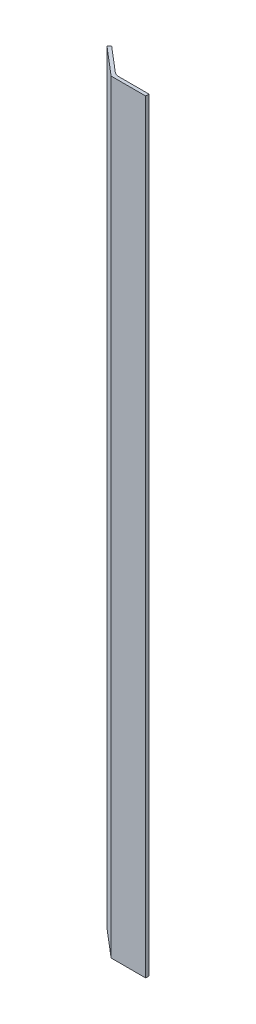
ISO-10303-21;
HEADER;
FILE_DESCRIPTION(('STEP AP214'),'2;1');
FILE_NAME('part.step','',(''),(''),'','','');
FILE_SCHEMA(('AUTOMOTIVE_DESIGN { 1 0 10303 214 1 1 1 1 }'));
ENDSEC;
DATA;
#1=APPLICATION_CONTEXT('core data for automotive mechanical design processes');
#2=APPLICATION_PROTOCOL_DEFINITION('international standard','automotive_design',2000,#1);
#3=PRODUCT_CONTEXT('',#1,'mechanical');
#4=PRODUCT('Part','Part','',(#3));
#5=PRODUCT_RELATED_PRODUCT_CATEGORY('part','',(#4));
#6=PRODUCT_DEFINITION_FORMATION('','',#4);
#7=PRODUCT_DEFINITION_CONTEXT('part definition',#1,'design');
#8=PRODUCT_DEFINITION('design','',#6,#7);
#9=PRODUCT_DEFINITION_SHAPE('','',#8);
#10=(LENGTH_UNIT() NAMED_UNIT(*) SI_UNIT(.MILLI.,.METRE.));
#11=(NAMED_UNIT(*) PLANE_ANGLE_UNIT() SI_UNIT($,.RADIAN.));
#12=(NAMED_UNIT(*) SI_UNIT($,.STERADIAN.) SOLID_ANGLE_UNIT());
#13=UNCERTAINTY_MEASURE_WITH_UNIT(LENGTH_MEASURE(1.E-05),#10,'distance_accuracy_value','');
#14=(GEOMETRIC_REPRESENTATION_CONTEXT(3) GLOBAL_UNCERTAINTY_ASSIGNED_CONTEXT((#13)) GLOBAL_UNIT_ASSIGNED_CONTEXT((#10,
#11,#12)) REPRESENTATION_CONTEXT('',''));
#15=CARTESIAN_POINT('',(0.,0.,0.));
#16=DIRECTION('',(0.,0.,1.));
#17=DIRECTION('',(1.,0.,0.));
#18=AXIS2_PLACEMENT_3D('',#15,#16,#17);
#19=CARTESIAN_POINT('',(-1.13337922469441,500.,-5.48688166985293));
#20=DIRECTION('',(0.,-1.,0.));
#21=DIRECTION('',(0.,0.,-1.));
#22=AXIS2_PLACEMENT_3D('',#19,#20,#21);
#23=CYLINDRICAL_SURFACE('',#22,5.);
#24=CARTESIAN_POINT('',(-1.13337922469441,40.,-5.48688166985293));
#25=DIRECTION('',(0.,-1.,0.));
#26=DIRECTION('',(0.,0.,-1.));
#27=AXIS2_PLACEMENT_3D('',#24,#25,#26);
#28=CIRCLE('',#27,5.);
#29=CARTESIAN_POINT('',(-1.13337922469441,40.,-0.486881669852926));
#30=VERTEX_POINT('',#29);
#31=CARTESIAN_POINT('',(-4.37520085986418,40.,-1.68023058448337));
#32=VERTEX_POINT('',#31);
#33=EDGE_CURVE('E121',#30,#32,#28,.T.);
#34=ORIENTED_EDGE('',*,*,#33,.T.);
#35=DIRECTION('',(0.,-1.,0.));
#36=VECTOR('',#35,1.);
#37=CARTESIAN_POINT('',(-4.37520085986418,500.,-1.68023058448337));
#38=LINE('',#37,#36);
#39=CARTESIAN_POINT('',(-4.37520085986418,500.,-1.68023058448337));
#40=VERTEX_POINT('',#39);
#41=EDGE_CURVE('E11',#40,#32,#38,.T.);
#42=ORIENTED_EDGE('',*,*,#41,.F.);
#43=CARTESIAN_POINT('',(-1.13337922469441,500.,-5.48688166985293));
#44=DIRECTION('',(0.,-1.,0.));
#45=DIRECTION('',(0.,0.,-1.));
#46=AXIS2_PLACEMENT_3D('',#43,#44,#45);
#47=CIRCLE('',#46,5.);
#48=CARTESIAN_POINT('',(-1.13337922469441,500.,-0.486881669852926));
#49=VERTEX_POINT('',#48);
#50=EDGE_CURVE('E133',#49,#40,#47,.T.);
#51=ORIENTED_EDGE('',*,*,#50,.F.);
#52=DIRECTION('',(0.,-1.,0.));
#53=VECTOR('',#52,1.);
#54=CARTESIAN_POINT('',(-1.13337922469441,500.,-0.486881669852926));
#55=LINE('',#54,#53);
#56=EDGE_CURVE('E117',#49,#30,#55,.T.);
#57=ORIENTED_EDGE('',*,*,#56,.T.);
#58=EDGE_LOOP('',(#34,#42,#51,#57));
#59=FACE_BOUND('',#58,.T.);
#60=ADVANCED_FACE('F31',(#59),#23,.F.);
#61=CARTESIAN_POINT('',(-19.2119654964128,500.,-14.3155216884001));
#62=DIRECTION('',(-0.648364327033953,0.,0.761330217073911));
#63=DIRECTION('',(0.761330217073912,0.,0.648364327033953));
#64=AXIS2_PLACEMENT_3D('',#61,#62,#63);
#65=PLANE('',#64);
#66=DIRECTION('',(-0.761330217073912,0.,-0.648364327033953));
#67=VECTOR('',#66,1.);
#68=CARTESIAN_POINT('',(-19.2119654964128,40.,-14.3155216884001));
#69=LINE('',#68,#67);
#70=CARTESIAN_POINT('',(-19.2119654964128,40.,-14.3155216884001));
#71=VERTEX_POINT('',#70);
#72=EDGE_CURVE('E124',#32,#71,#69,.T.);
#73=ORIENTED_EDGE('',*,*,#72,.T.);
#74=DIRECTION('',(0.,-1.,0.));
#75=VECTOR('',#74,1.);
#76=CARTESIAN_POINT('',(-19.2119654964128,500.,-14.3155216884001));
#77=LINE('',#76,#75);
#78=CARTESIAN_POINT('',(-19.2119654964128,500.,-14.3155216884001));
#79=VERTEX_POINT('',#78);
#80=EDGE_CURVE('E39',#79,#71,#77,.T.);
#81=ORIENTED_EDGE('',*,*,#80,.F.);
#82=DIRECTION('',(-0.761330217073912,0.,-0.648364327033953));
#83=VECTOR('',#82,1.);
#84=CARTESIAN_POINT('',(-19.2119654964128,500.,-14.3155216884001));
#85=LINE('',#84,#83);
#86=EDGE_CURVE('E87',#40,#79,#85,.T.);
#87=ORIENTED_EDGE('',*,*,#86,.F.);
#88=ORIENTED_EDGE('',*,*,#41,.T.);
#89=EDGE_LOOP('',(#73,#81,#87,#88));
#90=FACE_BOUND('',#89,.T.);
#91=ADVANCED_FACE('F158',(#90),#65,.F.);
#92=CARTESIAN_POINT('',(-20.5084475648758,500.,-12.792651291369));
#93=DIRECTION('',(0.761435198515556,0.,0.648241034231539));
#94=DIRECTION('',(0.648241034231539,0.,-0.761435198515556));
#95=AXIS2_PLACEMENT_3D('',#92,#93,#94);
#96=PLANE('',#95);
#97=DIRECTION('',(-0.648241034231539,0.,0.761435198515556));
#98=VECTOR('',#97,1.);
#99=CARTESIAN_POINT('',(-20.5084475648758,40.,-12.792651291369));
#100=LINE('',#99,#98);
#101=CARTESIAN_POINT('',(-20.5084475648758,40.,-12.792651291369));
#102=VERTEX_POINT('',#101);
#103=EDGE_CURVE('E126',#71,#102,#100,.T.);
#104=ORIENTED_EDGE('',*,*,#103,.T.);
#105=DIRECTION('',(0.,-1.,0.));
#106=VECTOR('',#105,1.);
#107=CARTESIAN_POINT('',(-20.5084475648758,500.,-12.792651291369));
#108=LINE('',#107,#106);
#109=CARTESIAN_POINT('',(-20.5084475648758,500.,-12.792651291369));
#110=VERTEX_POINT('',#109);
#111=EDGE_CURVE('E137',#110,#102,#108,.T.);
#112=ORIENTED_EDGE('',*,*,#111,.F.);
#113=DIRECTION('',(-0.648241034231539,0.,0.761435198515556));
#114=VECTOR('',#113,1.);
#115=CARTESIAN_POINT('',(-20.5084475648758,500.,-12.792651291369));
#116=LINE('',#115,#114);
#117=EDGE_CURVE('E145',#79,#110,#116,.T.);
#118=ORIENTED_EDGE('',*,*,#117,.F.);
#119=ORIENTED_EDGE('',*,*,#80,.T.);
#120=EDGE_LOOP('',(#104,#112,#118,#119));
#121=FACE_BOUND('',#120,.T.);
#122=ADVANCED_FACE('F143',(#121),#96,.F.);
#123=CARTESIAN_POINT('',(-20.5084475648758,500.,-12.792651291369));
#124=DIRECTION('',(0.64824103423154,0.,-0.761435198515556));
#125=DIRECTION('',(-0.761435198515556,0.,-0.64824103423154));
#126=AXIS2_PLACEMENT_3D('',#123,#124,#125);
#127=PLANE('',#126);
#128=DIRECTION('',(0.761435198515555,0.,0.64824103423154));
#129=VECTOR('',#128,1.);
#130=CARTESIAN_POINT('',(-20.5084475648758,40.,-12.792651291369));
#131=LINE('',#130,#129);
#132=CARTESIAN_POINT('',(-3.70464164013991,40.,1.51311833014707));
#133=VERTEX_POINT('',#132);
#134=EDGE_CURVE('E128',#102,#133,#131,.T.);
#135=ORIENTED_EDGE('',*,*,#134,.T.);
#136=DIRECTION('',(0.,-1.,0.));
#137=VECTOR('',#136,1.);
#138=CARTESIAN_POINT('',(-3.70464164013991,500.,1.51311833014707));
#139=LINE('',#138,#137);
#140=CARTESIAN_POINT('',(-3.70464164013991,500.,1.51311833014707));
#141=VERTEX_POINT('',#140);
#142=EDGE_CURVE('E112',#141,#133,#139,.T.);
#143=ORIENTED_EDGE('',*,*,#142,.F.);
#144=DIRECTION('',(0.761435198515555,0.,0.64824103423154));
#145=VECTOR('',#144,1.);
#146=CARTESIAN_POINT('',(-20.5084475648758,500.,-12.792651291369));
#147=LINE('',#146,#145);
#148=EDGE_CURVE('E103',#110,#141,#147,.T.);
#149=ORIENTED_EDGE('',*,*,#148,.F.);
#150=ORIENTED_EDGE('',*,*,#111,.T.);
#151=EDGE_LOOP('',(#135,#143,#149,#150));
#152=FACE_BOUND('',#151,.T.);
#153=ADVANCED_FACE('F151',(#152),#127,.F.);
#154=CARTESIAN_POINT('',(-3.70464164013991,500.,1.51311833014707));
#155=DIRECTION('',(0.,0.,-1.));
#156=DIRECTION('',(-1.,0.,0.));
#157=AXIS2_PLACEMENT_3D('',#154,#155,#156);
#158=PLANE('',#157);
#159=DIRECTION('',(1.,0.,0.));
#160=VECTOR('',#159,1.);
#161=CARTESIAN_POINT('',(-3.70464164013991,40.,1.51311833014707));
#162=LINE('',#161,#160);
#163=CARTESIAN_POINT('',(17.1228290420735,40.,1.51311833014707));
#164=VERTEX_POINT('',#163);
#165=EDGE_CURVE('E111',#133,#164,#162,.T.);
#166=ORIENTED_EDGE('',*,*,#165,.T.);
#167=DIRECTION('',(0.,-1.,0.));
#168=VECTOR('',#167,1.);
#169=CARTESIAN_POINT('',(17.1228290420735,500.,1.51311833014707));
#170=LINE('',#169,#168);
#171=CARTESIAN_POINT('',(17.1228290420735,500.,1.51311833014707));
#172=VERTEX_POINT('',#171);
#173=EDGE_CURVE('E108',#172,#164,#170,.T.);
#174=ORIENTED_EDGE('',*,*,#173,.F.);
#175=DIRECTION('',(1.,0.,0.));
#176=VECTOR('',#175,1.);
#177=CARTESIAN_POINT('',(-3.70464164013991,500.,1.51311833014707));
#178=LINE('',#177,#176);
#179=EDGE_CURVE('E97',#141,#172,#178,.T.);
#180=ORIENTED_EDGE('',*,*,#179,.F.);
#181=ORIENTED_EDGE('',*,*,#142,.T.);
#182=EDGE_LOOP('',(#166,#174,#180,#181));
#183=FACE_BOUND('',#182,.T.);
#184=ADVANCED_FACE('F109',(#183),#158,.F.);
#185=CARTESIAN_POINT('',(17.1228290420735,500.,1.51311833014707));
#186=DIRECTION('',(-1.,0.,0.));
#187=DIRECTION('',(0.,0.,1.));
#188=AXIS2_PLACEMENT_3D('',#185,#186,#187);
#189=PLANE('',#188);
#190=DIRECTION('',(0.,0.,-1.));
#191=VECTOR('',#190,1.);
#192=CARTESIAN_POINT('',(17.1228290420735,40.,1.51311833014707));
#193=LINE('',#192,#191);
#194=CARTESIAN_POINT('',(17.1228290420735,40.,-0.486881669852926));
#195=VERTEX_POINT('',#194);
#196=EDGE_CURVE('E73',#164,#195,#193,.T.);
#197=ORIENTED_EDGE('',*,*,#196,.T.);
#198=DIRECTION('',(0.,-1.,0.));
#199=VECTOR('',#198,1.);
#200=CARTESIAN_POINT('',(17.1228290420735,500.,-0.486881669852926));
#201=LINE('',#200,#199);
#202=CARTESIAN_POINT('',(17.1228290420735,500.,-0.486881669852926));
#203=VERTEX_POINT('',#202);
#204=EDGE_CURVE('E113',#203,#195,#201,.T.);
#205=ORIENTED_EDGE('',*,*,#204,.F.);
#206=DIRECTION('',(0.,0.,-1.));
#207=VECTOR('',#206,1.);
#208=CARTESIAN_POINT('',(17.1228290420735,500.,1.51311833014707));
#209=LINE('',#208,#207);
#210=EDGE_CURVE('E101',#172,#203,#209,.T.);
#211=ORIENTED_EDGE('',*,*,#210,.F.);
#212=ORIENTED_EDGE('',*,*,#173,.T.);
#213=EDGE_LOOP('',(#197,#205,#211,#212));
#214=FACE_BOUND('',#213,.T.);
#215=ADVANCED_FACE('F115',(#214),#189,.F.);
#216=CARTESIAN_POINT('',(-1.13337922469441,500.,-0.486881669852926));
#217=DIRECTION('',(0.,0.,1.));
#218=DIRECTION('',(1.,0.,0.));
#219=AXIS2_PLACEMENT_3D('',#216,#217,#218);
#220=PLANE('',#219);
#221=DIRECTION('',(-1.,0.,0.));
#222=VECTOR('',#221,1.);
#223=CARTESIAN_POINT('',(-1.13337922469441,40.,-0.486881669852926));
#224=LINE('',#223,#222);
#225=EDGE_CURVE('E79',#195,#30,#224,.T.);
#226=ORIENTED_EDGE('',*,*,#225,.T.);
#227=ORIENTED_EDGE('',*,*,#56,.F.);
#228=DIRECTION('',(-1.,0.,0.));
#229=VECTOR('',#228,1.);
#230=CARTESIAN_POINT('',(-1.13337922469441,500.,-0.486881669852926));
#231=LINE('',#230,#229);
#232=EDGE_CURVE('E47',#203,#49,#231,.T.);
#233=ORIENTED_EDGE('',*,*,#232,.F.);
#234=ORIENTED_EDGE('',*,*,#204,.T.);
#235=EDGE_LOOP('',(#226,#227,#233,#234));
#236=FACE_BOUND('',#235,.T.);
#237=ADVANCED_FACE('F172',(#236),#220,.F.);
#238=CARTESIAN_POINT('',(-1.13337922469441,500.,-5.48688166985293));
#239=DIRECTION('',(0.,-1.,0.));
#240=DIRECTION('',(0.,0.,-1.));
#241=AXIS2_PLACEMENT_3D('',#238,#239,#240);
#242=PLANE('',#241);
#243=ORIENTED_EDGE('',*,*,#50,.T.);
#244=ORIENTED_EDGE('',*,*,#86,.T.);
#245=ORIENTED_EDGE('',*,*,#117,.T.);
#246=ORIENTED_EDGE('',*,*,#148,.T.);
#247=ORIENTED_EDGE('',*,*,#179,.T.);
#248=ORIENTED_EDGE('',*,*,#210,.T.);
#249=ORIENTED_EDGE('',*,*,#232,.T.);
#250=EDGE_LOOP('',(#243,#244,#245,#246,#247,#248,#249));
#251=FACE_BOUND('',#250,.T.);
#252=ADVANCED_FACE('F99',(#251),#242,.F.);
#253=CARTESIAN_POINT('',(-1.13337922469441,40.,-5.48688166985293));
#254=DIRECTION('',(0.,-1.,0.));
#255=DIRECTION('',(0.,0.,-1.));
#256=AXIS2_PLACEMENT_3D('',#253,#254,#255);
#257=PLANE('',#256);
#258=ORIENTED_EDGE('',*,*,#33,.F.);
#259=ORIENTED_EDGE('',*,*,#225,.F.);
#260=ORIENTED_EDGE('',*,*,#196,.F.);
#261=ORIENTED_EDGE('',*,*,#165,.F.);
#262=ORIENTED_EDGE('',*,*,#134,.F.);
#263=ORIENTED_EDGE('',*,*,#103,.F.);
#264=ORIENTED_EDGE('',*,*,#72,.F.);
#265=EDGE_LOOP('',(#258,#259,#260,#261,#262,#263,#264));
#266=FACE_BOUND('',#265,.T.);
#267=ADVANCED_FACE('F149',(#266),#257,.T.);
#268=CLOSED_SHELL('',(#60,#91,#122,#153,#184,#215,#237,#252,#267));
#269=MANIFOLD_SOLID_BREP('B2',#268);
#270=ADVANCED_BREP_SHAPE_REPRESENTATION('',(#18,#269),#14);
#271=SHAPE_DEFINITION_REPRESENTATION(#9,#270);
ENDSEC;
END-ISO-10303-21;
